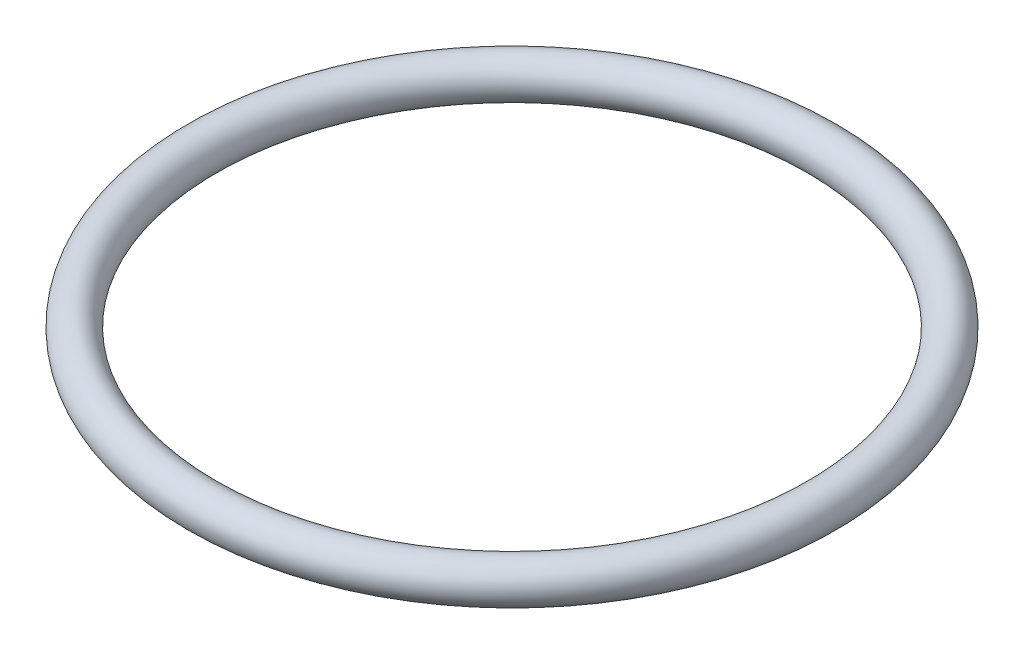
ISO-10303-21;
HEADER;
FILE_DESCRIPTION(('STEP AP214'),'2;1');
FILE_NAME('part.step','',(''),(''),'','','');
FILE_SCHEMA(('AUTOMOTIVE_DESIGN { 1 0 10303 214 1 1 1 1 }'));
ENDSEC;
DATA;
#1=APPLICATION_CONTEXT('core data for automotive mechanical design processes');
#2=APPLICATION_PROTOCOL_DEFINITION('international standard','automotive_design',2000,#1);
#3=PRODUCT_CONTEXT('',#1,'mechanical');
#4=PRODUCT('Part','Part','',(#3));
#5=PRODUCT_RELATED_PRODUCT_CATEGORY('part','',(#4));
#6=PRODUCT_DEFINITION_FORMATION('','',#4);
#7=PRODUCT_DEFINITION_CONTEXT('part definition',#1,'design');
#8=PRODUCT_DEFINITION('design','',#6,#7);
#9=PRODUCT_DEFINITION_SHAPE('','',#8);
#10=(LENGTH_UNIT() NAMED_UNIT(*) SI_UNIT(.MILLI.,.METRE.));
#11=(NAMED_UNIT(*) PLANE_ANGLE_UNIT() SI_UNIT($,.RADIAN.));
#12=(NAMED_UNIT(*) SI_UNIT($,.STERADIAN.) SOLID_ANGLE_UNIT());
#13=UNCERTAINTY_MEASURE_WITH_UNIT(LENGTH_MEASURE(1.E-05),#10,'distance_accuracy_value','');
#14=(GEOMETRIC_REPRESENTATION_CONTEXT(3) GLOBAL_UNCERTAINTY_ASSIGNED_CONTEXT((#13)) GLOBAL_UNIT_ASSIGNED_CONTEXT((#10,
#11,#12)) REPRESENTATION_CONTEXT('',''));
#15=CARTESIAN_POINT('',(0.,0.,0.));
#16=DIRECTION('',(0.,0.,1.));
#17=DIRECTION('',(1.,0.,0.));
#18=AXIS2_PLACEMENT_3D('',#15,#16,#17);
#19=CARTESIAN_POINT('',(0.,0.,0.));
#20=DIRECTION('',(0.,1.,0.));
#21=DIRECTION('',(0.,0.,1.));
#22=AXIS2_PLACEMENT_3D('',#19,#20,#21);
#23=TOROIDAL_SURFACE('',#22,22.42,1.45);
#24=CARTESIAN_POINT('',(0.,0.,23.87));
#25=VERTEX_POINT('',#24);
#26=VERTEX_LOOP('',#25);
#27=FACE_BOUND('',#26,.T.);
#28=ADVANCED_FACE('F28',(#27),#23,.T.);
#29=CLOSED_SHELL('',(#28));
#30=MANIFOLD_SOLID_BREP('B2',#29);
#31=ADVANCED_BREP_SHAPE_REPRESENTATION('',(#18,#30),#14);
#32=SHAPE_DEFINITION_REPRESENTATION(#9,#31);
ENDSEC;
END-ISO-10303-21;
